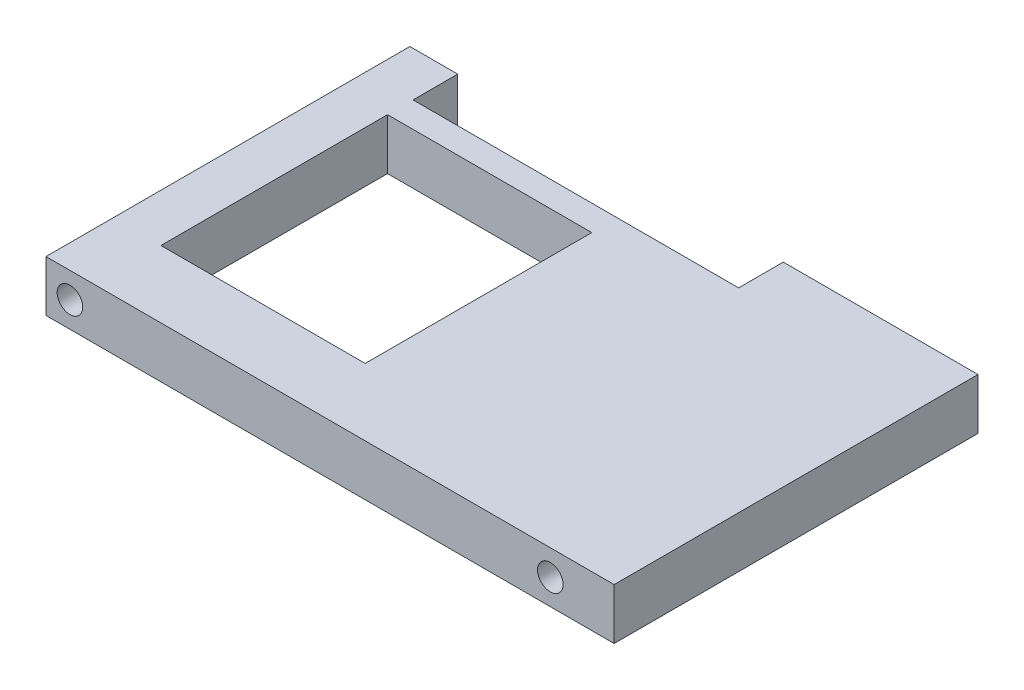
ISO-10303-21;
HEADER;
FILE_DESCRIPTION(('STEP AP214'),'2;1');
FILE_NAME('part.step','',(''),(''),'','','');
FILE_SCHEMA(('AUTOMOTIVE_DESIGN { 1 0 10303 214 1 1 1 1 }'));
ENDSEC;
DATA;
#1=APPLICATION_CONTEXT('core data for automotive mechanical design processes');
#2=APPLICATION_PROTOCOL_DEFINITION('international standard','automotive_design',2000,#1);
#3=PRODUCT_CONTEXT('',#1,'mechanical');
#4=PRODUCT('Part','Part','',(#3));
#5=PRODUCT_RELATED_PRODUCT_CATEGORY('part','',(#4));
#6=PRODUCT_DEFINITION_FORMATION('','',#4);
#7=PRODUCT_DEFINITION_CONTEXT('part definition',#1,'design');
#8=PRODUCT_DEFINITION('design','',#6,#7);
#9=PRODUCT_DEFINITION_SHAPE('','',#8);
#10=(LENGTH_UNIT() NAMED_UNIT(*) SI_UNIT(.MILLI.,.METRE.));
#11=(NAMED_UNIT(*) PLANE_ANGLE_UNIT() SI_UNIT($,.RADIAN.));
#12=(NAMED_UNIT(*) SI_UNIT($,.STERADIAN.) SOLID_ANGLE_UNIT());
#13=UNCERTAINTY_MEASURE_WITH_UNIT(LENGTH_MEASURE(1.E-05),#10,'distance_accuracy_value','');
#14=(GEOMETRIC_REPRESENTATION_CONTEXT(3) GLOBAL_UNCERTAINTY_ASSIGNED_CONTEXT((#13)) GLOBAL_UNIT_ASSIGNED_CONTEXT((#10,
#11,#12)) REPRESENTATION_CONTEXT('',''));
#15=CARTESIAN_POINT('',(0.,0.,0.));
#16=DIRECTION('',(0.,0.,1.));
#17=DIRECTION('',(1.,0.,0.));
#18=AXIS2_PLACEMENT_3D('',#15,#16,#17);
#19=CARTESIAN_POINT('',(0.,8.,-57.));
#20=DIRECTION('',(0.,0.,-1.));
#21=DIRECTION('',(-1.,0.,0.));
#22=AXIS2_PLACEMENT_3D('',#19,#20,#21);
#23=PLANE('',#22);
#24=CARTESIAN_POINT('',(3.75,4.,-57.));
#25=DIRECTION('',(0.,0.,1.));
#26=DIRECTION('',(1.,0.,0.));
#27=AXIS2_PLACEMENT_3D('',#24,#25,#26);
#28=CIRCLE('',#27,2.);
#29=CARTESIAN_POINT('',(5.75,4.,-57.));
#30=VERTEX_POINT('',#29);
#31=EDGE_CURVE('E272',#30,#30,#28,.T.);
#32=ORIENTED_EDGE('',*,*,#31,.T.);
#33=EDGE_LOOP('',(#32));
#34=FACE_BOUND('',#33,.T.);
#35=DIRECTION('',(1.,0.,0.));
#36=VECTOR('',#35,1.);
#37=CARTESIAN_POINT('',(0.,8.,-57.));
#38=LINE('',#37,#36);
#39=CARTESIAN_POINT('',(0.,8.,-57.));
#40=VERTEX_POINT('',#39);
#41=CARTESIAN_POINT('',(7.49999999999998,8.,-57.));
#42=VERTEX_POINT('',#41);
#43=EDGE_CURVE('E197',#40,#42,#38,.T.);
#44=ORIENTED_EDGE('',*,*,#43,.T.);
#45=DIRECTION('',(0.,1.,0.));
#46=VECTOR('',#45,1.);
#47=CARTESIAN_POINT('',(7.49999999999998,0.,-57.));
#48=LINE('',#47,#46);
#49=CARTESIAN_POINT('',(7.49999999999998,0.,-57.));
#50=VERTEX_POINT('',#49);
#51=EDGE_CURVE('E188',#50,#42,#48,.T.);
#52=ORIENTED_EDGE('',*,*,#51,.F.);
#53=DIRECTION('',(1.,0.,0.));
#54=VECTOR('',#53,1.);
#55=CARTESIAN_POINT('',(0.,0.,-57.));
#56=LINE('',#55,#54);
#57=CARTESIAN_POINT('',(0.,0.,-57.));
#58=VERTEX_POINT('',#57);
#59=EDGE_CURVE('E208',#58,#50,#56,.T.);
#60=ORIENTED_EDGE('',*,*,#59,.F.);
#61=DIRECTION('',(0.,-1.,0.));
#62=VECTOR('',#61,1.);
#63=CARTESIAN_POINT('',(0.,8.,-57.));
#64=LINE('',#63,#62);
#65=EDGE_CURVE('E41',#40,#58,#64,.T.);
#66=ORIENTED_EDGE('',*,*,#65,.F.);
#67=EDGE_LOOP('',(#44,#52,#60,#66));
#68=FACE_BOUND('',#67,.T.);
#69=ADVANCED_FACE('F37',(#34,#68),#23,.T.);
#70=CARTESIAN_POINT('',(0.,8.,0.));
#71=DIRECTION('',(0.,-1.,0.));
#72=DIRECTION('',(0.,0.,-1.));
#73=AXIS2_PLACEMENT_3D('',#70,#71,#72);
#74=PLANE('',#73);
#75=CARTESIAN_POINT('',(58.5,8.,-57.));
#76=VERTEX_POINT('',#75);
#77=CARTESIAN_POINT('',(89.,8.,-57.));
#78=VERTEX_POINT('',#77);
#79=EDGE_CURVE('E195',#76,#78,#38,.T.);
#80=ORIENTED_EDGE('',*,*,#79,.F.);
#81=DIRECTION('',(0.,0.,-1.));
#82=VECTOR('',#81,1.);
#83=CARTESIAN_POINT('',(58.5,8.,0.));
#84=LINE('',#83,#82);
#85=CARTESIAN_POINT('',(58.5,8.,-50.));
#86=VERTEX_POINT('',#85);
#87=EDGE_CURVE('E177',#86,#76,#84,.T.);
#88=ORIENTED_EDGE('',*,*,#87,.F.);
#89=DIRECTION('',(1.,0.,0.));
#90=VECTOR('',#89,1.);
#91=CARTESIAN_POINT('',(0.,8.,-50.));
#92=LINE('',#91,#90);
#93=CARTESIAN_POINT('',(7.49999999999997,8.,-50.));
#94=VERTEX_POINT('',#93);
#95=EDGE_CURVE('E171',#94,#86,#92,.T.);
#96=ORIENTED_EDGE('',*,*,#95,.F.);
#97=DIRECTION('',(0.,0.,-1.));
#98=VECTOR('',#97,1.);
#99=CARTESIAN_POINT('',(7.5,8.,0.));
#100=LINE('',#99,#98);
#101=EDGE_CURVE('E179',#94,#42,#100,.T.);
#102=ORIENTED_EDGE('',*,*,#101,.T.);
#103=ORIENTED_EDGE('',*,*,#43,.F.);
#104=DIRECTION('',(0.,0.,-1.));
#105=VECTOR('',#104,1.);
#106=CARTESIAN_POINT('',(0.,8.,0.));
#107=LINE('',#106,#105);
#108=CARTESIAN_POINT('',(0.,8.,0.));
#109=VERTEX_POINT('',#108);
#110=EDGE_CURVE('E192',#109,#40,#107,.T.);
#111=ORIENTED_EDGE('',*,*,#110,.F.);
#112=DIRECTION('',(1.,0.,0.));
#113=VECTOR('',#112,1.);
#114=CARTESIAN_POINT('',(0.,8.,0.));
#115=LINE('',#114,#113);
#116=CARTESIAN_POINT('',(89.,8.,0.));
#117=VERTEX_POINT('',#116);
#118=EDGE_CURVE('E203',#109,#117,#115,.T.);
#119=ORIENTED_EDGE('',*,*,#118,.T.);
#120=DIRECTION('',(0.,0.,-1.));
#121=VECTOR('',#120,1.);
#122=CARTESIAN_POINT('',(89.,8.,0.));
#123=LINE('',#122,#121);
#124=EDGE_CURVE('E200',#117,#78,#123,.T.);
#125=ORIENTED_EDGE('',*,*,#124,.T.);
#126=EDGE_LOOP('',(#80,#88,#96,#102,#103,#111,#119,#125));
#127=FACE_BOUND('',#126,.T.);
#128=DIRECTION('',(1.,0.,0.));
#129=VECTOR('',#128,1.);
#130=CARTESIAN_POINT('',(0.,8.,-46.));
#131=LINE('',#130,#129);
#132=CARTESIAN_POINT('',(7.49999999999998,8.,-46.));
#133=VERTEX_POINT('',#132);
#134=CARTESIAN_POINT('',(39.5,8.,-46.));
#135=VERTEX_POINT('',#134);
#136=EDGE_CURVE('E54',#133,#135,#131,.T.);
#137=ORIENTED_EDGE('',*,*,#136,.T.);
#138=DIRECTION('',(0.,0.,-1.));
#139=VECTOR('',#138,1.);
#140=CARTESIAN_POINT('',(39.5,8.,0.));
#141=LINE('',#140,#139);
#142=CARTESIAN_POINT('',(39.5,8.,-10.5));
#143=VERTEX_POINT('',#142);
#144=EDGE_CURVE('E144',#143,#135,#141,.T.);
#145=ORIENTED_EDGE('',*,*,#144,.F.);
#146=DIRECTION('',(1.,0.,0.));
#147=VECTOR('',#146,1.);
#148=CARTESIAN_POINT('',(0.,8.,-10.5));
#149=LINE('',#148,#147);
#150=CARTESIAN_POINT('',(7.49999999999999,8.,-10.5));
#151=VERTEX_POINT('',#150);
#152=EDGE_CURVE('E147',#151,#143,#149,.T.);
#153=ORIENTED_EDGE('',*,*,#152,.F.);
#154=DIRECTION('',(0.,0.,-1.));
#155=VECTOR('',#154,1.);
#156=CARTESIAN_POINT('',(7.5,8.,0.));
#157=LINE('',#156,#155);
#158=EDGE_CURVE('E156',#151,#133,#157,.T.);
#159=ORIENTED_EDGE('',*,*,#158,.T.);
#160=EDGE_LOOP('',(#137,#145,#153,#159));
#161=FACE_BOUND('',#160,.T.);
#162=ADVANCED_FACE('F241',(#127,#161),#74,.F.);
#163=CARTESIAN_POINT('',(0.,0.,0.));
#164=DIRECTION('',(0.,-1.,0.));
#165=DIRECTION('',(0.,0.,-1.));
#166=AXIS2_PLACEMENT_3D('',#163,#164,#165);
#167=PLANE('',#166);
#168=DIRECTION('',(0.,0.,-1.));
#169=VECTOR('',#168,1.);
#170=CARTESIAN_POINT('',(58.5,0.,0.));
#171=LINE('',#170,#169);
#172=CARTESIAN_POINT('',(58.5,0.,-50.));
#173=VERTEX_POINT('',#172);
#174=CARTESIAN_POINT('',(58.5,0.,-57.));
#175=VERTEX_POINT('',#174);
#176=EDGE_CURVE('E167',#173,#175,#171,.T.);
#177=ORIENTED_EDGE('',*,*,#176,.T.);
#178=CARTESIAN_POINT('',(89.,0.,-57.));
#179=VERTEX_POINT('',#178);
#180=EDGE_CURVE('E207',#175,#179,#56,.T.);
#181=ORIENTED_EDGE('',*,*,#180,.T.);
#182=DIRECTION('',(0.,0.,-1.));
#183=VECTOR('',#182,1.);
#184=CARTESIAN_POINT('',(89.,0.,0.));
#185=LINE('',#184,#183);
#186=CARTESIAN_POINT('',(89.,0.,0.));
#187=VERTEX_POINT('',#186);
#188=EDGE_CURVE('E211',#187,#179,#185,.T.);
#189=ORIENTED_EDGE('',*,*,#188,.F.);
#190=DIRECTION('',(1.,0.,0.));
#191=VECTOR('',#190,1.);
#192=CARTESIAN_POINT('',(0.,0.,0.));
#193=LINE('',#192,#191);
#194=CARTESIAN_POINT('',(0.,0.,0.));
#195=VERTEX_POINT('',#194);
#196=EDGE_CURVE('E196',#195,#187,#193,.T.);
#197=ORIENTED_EDGE('',*,*,#196,.F.);
#198=DIRECTION('',(0.,0.,-1.));
#199=VECTOR('',#198,1.);
#200=CARTESIAN_POINT('',(0.,0.,0.));
#201=LINE('',#200,#199);
#202=EDGE_CURVE('E163',#195,#58,#201,.T.);
#203=ORIENTED_EDGE('',*,*,#202,.T.);
#204=ORIENTED_EDGE('',*,*,#59,.T.);
#205=DIRECTION('',(0.,0.,-1.));
#206=VECTOR('',#205,1.);
#207=CARTESIAN_POINT('',(7.5,0.,0.));
#208=LINE('',#207,#206);
#209=CARTESIAN_POINT('',(7.49999999999997,0.,-50.));
#210=VERTEX_POINT('',#209);
#211=EDGE_CURVE('E170',#210,#50,#208,.T.);
#212=ORIENTED_EDGE('',*,*,#211,.F.);
#213=DIRECTION('',(1.,0.,0.));
#214=VECTOR('',#213,1.);
#215=CARTESIAN_POINT('',(0.,0.,-50.));
#216=LINE('',#215,#214);
#217=EDGE_CURVE('E173',#210,#173,#216,.T.);
#218=ORIENTED_EDGE('',*,*,#217,.T.);
#219=EDGE_LOOP('',(#177,#181,#189,#197,#203,#204,#212,#218));
#220=FACE_BOUND('',#219,.T.);
#221=DIRECTION('',(0.,0.,-1.));
#222=VECTOR('',#221,1.);
#223=CARTESIAN_POINT('',(39.5,0.,0.));
#224=LINE('',#223,#222);
#225=CARTESIAN_POINT('',(39.5,0.,-10.5));
#226=VERTEX_POINT('',#225);
#227=CARTESIAN_POINT('',(39.5,0.,-46.));
#228=VERTEX_POINT('',#227);
#229=EDGE_CURVE('E139',#226,#228,#224,.T.);
#230=ORIENTED_EDGE('',*,*,#229,.T.);
#231=DIRECTION('',(1.,0.,0.));
#232=VECTOR('',#231,1.);
#233=CARTESIAN_POINT('',(0.,0.,-46.));
#234=LINE('',#233,#232);
#235=CARTESIAN_POINT('',(7.49999999999998,0.,-46.));
#236=VERTEX_POINT('',#235);
#237=EDGE_CURVE('E135',#236,#228,#234,.T.);
#238=ORIENTED_EDGE('',*,*,#237,.F.);
#239=DIRECTION('',(0.,0.,-1.));
#240=VECTOR('',#239,1.);
#241=CARTESIAN_POINT('',(7.5,0.,0.));
#242=LINE('',#241,#240);
#243=CARTESIAN_POINT('',(7.49999999999999,0.,-10.5));
#244=VERTEX_POINT('',#243);
#245=EDGE_CURVE('E127',#244,#236,#242,.T.);
#246=ORIENTED_EDGE('',*,*,#245,.F.);
#247=DIRECTION('',(1.,0.,0.));
#248=VECTOR('',#247,1.);
#249=CARTESIAN_POINT('',(0.,0.,-10.5));
#250=LINE('',#249,#248);
#251=EDGE_CURVE('E62',#244,#226,#250,.T.);
#252=ORIENTED_EDGE('',*,*,#251,.T.);
#253=EDGE_LOOP('',(#230,#238,#246,#252));
#254=FACE_BOUND('',#253,.T.);
#255=ADVANCED_FACE('F142',(#220,#254),#167,.T.);
#256=CARTESIAN_POINT('',(0.,8.,0.));
#257=DIRECTION('',(-1.,0.,0.));
#258=DIRECTION('',(0.,0.,1.));
#259=AXIS2_PLACEMENT_3D('',#256,#257,#258);
#260=PLANE('',#259);
#261=ORIENTED_EDGE('',*,*,#202,.F.);
#262=DIRECTION('',(0.,-1.,0.));
#263=VECTOR('',#262,1.);
#264=CARTESIAN_POINT('',(0.,8.,0.));
#265=LINE('',#264,#263);
#266=EDGE_CURVE('E11',#109,#195,#265,.T.);
#267=ORIENTED_EDGE('',*,*,#266,.F.);
#268=ORIENTED_EDGE('',*,*,#110,.T.);
#269=ORIENTED_EDGE('',*,*,#65,.T.);
#270=EDGE_LOOP('',(#261,#267,#268,#269));
#271=FACE_BOUND('',#270,.T.);
#272=ADVANCED_FACE('F39',(#271),#260,.T.);
#273=CARTESIAN_POINT('',(0.,8.,0.));
#274=DIRECTION('',(0.,0.,-1.));
#275=DIRECTION('',(-1.,0.,0.));
#276=AXIS2_PLACEMENT_3D('',#273,#274,#275);
#277=PLANE('',#276);
#278=CARTESIAN_POINT('',(3.75,4.,0.));
#279=DIRECTION('',(0.,0.,1.));
#280=DIRECTION('',(1.,0.,0.));
#281=AXIS2_PLACEMENT_3D('',#278,#279,#280);
#282=CIRCLE('',#281,2.);
#283=CARTESIAN_POINT('',(5.75,4.,0.));
#284=VERTEX_POINT('',#283);
#285=EDGE_CURVE('E286',#284,#284,#282,.T.);
#286=ORIENTED_EDGE('',*,*,#285,.F.);
#287=EDGE_LOOP('',(#286));
#288=FACE_BOUND('',#287,.T.);
#289=CARTESIAN_POINT('',(79.,4.,0.));
#290=DIRECTION('',(0.,0.,1.));
#291=DIRECTION('',(1.,0.,0.));
#292=AXIS2_PLACEMENT_3D('',#289,#290,#291);
#293=CIRCLE('',#292,2.);
#294=CARTESIAN_POINT('',(81.,4.,0.));
#295=VERTEX_POINT('',#294);
#296=EDGE_CURVE('E288',#295,#295,#293,.T.);
#297=ORIENTED_EDGE('',*,*,#296,.F.);
#298=EDGE_LOOP('',(#297));
#299=FACE_BOUND('',#298,.T.);
#300=ORIENTED_EDGE('',*,*,#196,.T.);
#301=DIRECTION('',(0.,-1.,0.));
#302=VECTOR('',#301,1.);
#303=CARTESIAN_POINT('',(89.,8.,0.));
#304=LINE('',#303,#302);
#305=EDGE_CURVE('E46',#117,#187,#304,.T.);
#306=ORIENTED_EDGE('',*,*,#305,.F.);
#307=ORIENTED_EDGE('',*,*,#118,.F.);
#308=ORIENTED_EDGE('',*,*,#266,.T.);
#309=EDGE_LOOP('',(#300,#306,#307,#308));
#310=FACE_BOUND('',#309,.T.);
#311=ADVANCED_FACE('F234',(#288,#299,#310),#277,.F.);
#312=CARTESIAN_POINT('',(89.,8.,0.));
#313=DIRECTION('',(-1.,0.,0.));
#314=DIRECTION('',(0.,0.,1.));
#315=AXIS2_PLACEMENT_3D('',#312,#313,#314);
#316=PLANE('',#315);
#317=ORIENTED_EDGE('',*,*,#188,.T.);
#318=DIRECTION('',(0.,-1.,0.));
#319=VECTOR('',#318,1.);
#320=CARTESIAN_POINT('',(89.,8.,-57.));
#321=LINE('',#320,#319);
#322=EDGE_CURVE('E216',#78,#179,#321,.T.);
#323=ORIENTED_EDGE('',*,*,#322,.F.);
#324=ORIENTED_EDGE('',*,*,#124,.F.);
#325=ORIENTED_EDGE('',*,*,#305,.T.);
#326=EDGE_LOOP('',(#317,#323,#324,#325));
#327=FACE_BOUND('',#326,.T.);
#328=ADVANCED_FACE('F238',(#327),#316,.F.);
#329=CARTESIAN_POINT('',(79.,4.,-57.));
#330=DIRECTION('',(0.,0.,1.));
#331=DIRECTION('',(1.,0.,0.));
#332=AXIS2_PLACEMENT_3D('',#329,#330,#331);
#333=CIRCLE('',#332,2.);
#334=CARTESIAN_POINT('',(81.,4.,-57.));
#335=VERTEX_POINT('',#334);
#336=EDGE_CURVE('E280',#335,#335,#333,.T.);
#337=ORIENTED_EDGE('',*,*,#336,.T.);
#338=EDGE_LOOP('',(#337));
#339=FACE_BOUND('',#338,.T.);
#340=DIRECTION('',(0.,1.,0.));
#341=VECTOR('',#340,1.);
#342=CARTESIAN_POINT('',(58.5,0.,-57.));
#343=LINE('',#342,#341);
#344=EDGE_CURVE('E176',#175,#76,#343,.T.);
#345=ORIENTED_EDGE('',*,*,#344,.T.);
#346=ORIENTED_EDGE('',*,*,#79,.T.);
#347=ORIENTED_EDGE('',*,*,#322,.T.);
#348=ORIENTED_EDGE('',*,*,#180,.F.);
#349=EDGE_LOOP('',(#345,#346,#347,#348));
#350=FACE_BOUND('',#349,.T.);
#351=ADVANCED_FACE('F254',(#339,#350),#23,.T.);
#352=CARTESIAN_POINT('',(58.5,0.,0.));
#353=DIRECTION('',(1.,0.,0.));
#354=DIRECTION('',(0.,0.,-1.));
#355=AXIS2_PLACEMENT_3D('',#352,#353,#354);
#356=PLANE('',#355);
#357=ORIENTED_EDGE('',*,*,#87,.T.);
#358=ORIENTED_EDGE('',*,*,#344,.F.);
#359=ORIENTED_EDGE('',*,*,#176,.F.);
#360=DIRECTION('',(0.,1.,0.));
#361=VECTOR('',#360,1.);
#362=CARTESIAN_POINT('',(58.5,0.,-50.));
#363=LINE('',#362,#361);
#364=EDGE_CURVE('E157',#173,#86,#363,.T.);
#365=ORIENTED_EDGE('',*,*,#364,.T.);
#366=EDGE_LOOP('',(#357,#358,#359,#365));
#367=FACE_BOUND('',#366,.T.);
#368=ADVANCED_FACE('F253',(#367),#356,.F.);
#369=CARTESIAN_POINT('',(0.,0.,-50.));
#370=DIRECTION('',(0.,0.,1.));
#371=DIRECTION('',(1.,0.,0.));
#372=AXIS2_PLACEMENT_3D('',#369,#370,#371);
#373=PLANE('',#372);
#374=ORIENTED_EDGE('',*,*,#95,.T.);
#375=ORIENTED_EDGE('',*,*,#364,.F.);
#376=ORIENTED_EDGE('',*,*,#217,.F.);
#377=DIRECTION('',(0.,1.,0.));
#378=VECTOR('',#377,1.);
#379=CARTESIAN_POINT('',(7.49999999999997,0.,-50.));
#380=LINE('',#379,#378);
#381=EDGE_CURVE('E186',#210,#94,#380,.T.);
#382=ORIENTED_EDGE('',*,*,#381,.T.);
#383=EDGE_LOOP('',(#374,#375,#376,#382));
#384=FACE_BOUND('',#383,.T.);
#385=ADVANCED_FACE('F251',(#384),#373,.F.);
#386=CARTESIAN_POINT('',(7.5,0.,0.));
#387=DIRECTION('',(1.,0.,0.));
#388=DIRECTION('',(0.,0.,-1.));
#389=AXIS2_PLACEMENT_3D('',#386,#387,#388);
#390=PLANE('',#389);
#391=ORIENTED_EDGE('',*,*,#101,.F.);
#392=ORIENTED_EDGE('',*,*,#381,.F.);
#393=ORIENTED_EDGE('',*,*,#211,.T.);
#394=ORIENTED_EDGE('',*,*,#51,.T.);
#395=EDGE_LOOP('',(#391,#392,#393,#394));
#396=FACE_BOUND('',#395,.T.);
#397=ADVANCED_FACE('F248',(#396),#390,.T.);
#398=CARTESIAN_POINT('',(0.,0.,-46.));
#399=DIRECTION('',(0.,0.,1.));
#400=DIRECTION('',(1.,0.,0.));
#401=AXIS2_PLACEMENT_3D('',#398,#399,#400);
#402=PLANE('',#401);
#403=ORIENTED_EDGE('',*,*,#136,.F.);
#404=DIRECTION('',(0.,1.,0.));
#405=VECTOR('',#404,1.);
#406=CARTESIAN_POINT('',(7.49999999999998,0.,-46.));
#407=LINE('',#406,#405);
#408=EDGE_CURVE('E130',#236,#133,#407,.T.);
#409=ORIENTED_EDGE('',*,*,#408,.F.);
#410=ORIENTED_EDGE('',*,*,#237,.T.);
#411=DIRECTION('',(0.,1.,0.));
#412=VECTOR('',#411,1.);
#413=CARTESIAN_POINT('',(39.5,0.,-46.));
#414=LINE('',#413,#412);
#415=EDGE_CURVE('E161',#228,#135,#414,.T.);
#416=ORIENTED_EDGE('',*,*,#415,.T.);
#417=EDGE_LOOP('',(#403,#409,#410,#416));
#418=FACE_BOUND('',#417,.T.);
#419=ADVANCED_FACE('F137',(#418),#402,.T.);
#420=CARTESIAN_POINT('',(39.5,0.,0.));
#421=DIRECTION('',(1.,0.,0.));
#422=DIRECTION('',(0.,0.,-1.));
#423=AXIS2_PLACEMENT_3D('',#420,#421,#422);
#424=PLANE('',#423);
#425=ORIENTED_EDGE('',*,*,#144,.T.);
#426=ORIENTED_EDGE('',*,*,#415,.F.);
#427=ORIENTED_EDGE('',*,*,#229,.F.);
#428=DIRECTION('',(0.,1.,0.));
#429=VECTOR('',#428,1.);
#430=CARTESIAN_POINT('',(39.5,0.,-10.5));
#431=LINE('',#430,#429);
#432=EDGE_CURVE('E164',#226,#143,#431,.T.);
#433=ORIENTED_EDGE('',*,*,#432,.T.);
#434=EDGE_LOOP('',(#425,#426,#427,#433));
#435=FACE_BOUND('',#434,.T.);
#436=ADVANCED_FACE('F311',(#435),#424,.F.);
#437=CARTESIAN_POINT('',(0.,0.,-10.5));
#438=DIRECTION('',(0.,0.,1.));
#439=DIRECTION('',(1.,0.,0.));
#440=AXIS2_PLACEMENT_3D('',#437,#438,#439);
#441=PLANE('',#440);
#442=ORIENTED_EDGE('',*,*,#152,.T.);
#443=ORIENTED_EDGE('',*,*,#432,.F.);
#444=ORIENTED_EDGE('',*,*,#251,.F.);
#445=DIRECTION('',(0.,1.,0.));
#446=VECTOR('',#445,1.);
#447=CARTESIAN_POINT('',(7.49999999999999,0.,-10.5));
#448=LINE('',#447,#446);
#449=EDGE_CURVE('E132',#244,#151,#448,.T.);
#450=ORIENTED_EDGE('',*,*,#449,.T.);
#451=EDGE_LOOP('',(#442,#443,#444,#450));
#452=FACE_BOUND('',#451,.T.);
#453=ADVANCED_FACE('F306',(#452),#441,.F.);
#454=CARTESIAN_POINT('',(7.5,0.,0.));
#455=DIRECTION('',(1.,0.,0.));
#456=DIRECTION('',(0.,0.,-1.));
#457=AXIS2_PLACEMENT_3D('',#454,#455,#456);
#458=PLANE('',#457);
#459=ORIENTED_EDGE('',*,*,#158,.F.);
#460=ORIENTED_EDGE('',*,*,#449,.F.);
#461=ORIENTED_EDGE('',*,*,#245,.T.);
#462=ORIENTED_EDGE('',*,*,#408,.T.);
#463=EDGE_LOOP('',(#459,#460,#461,#462));
#464=FACE_BOUND('',#463,.T.);
#465=ADVANCED_FACE('F129',(#464),#458,.T.);
#466=CARTESIAN_POINT('',(79.,4.,-6.7));
#467=DIRECTION('',(0.,0.,1.));
#468=DIRECTION('',(1.,0.,0.));
#469=AXIS2_PLACEMENT_3D('',#466,#467,#468);
#470=CYLINDRICAL_SURFACE('',#469,2.);
#471=CARTESIAN_POINT('',(79.,4.,-6.7));
#472=DIRECTION('',(0.,0.,1.));
#473=DIRECTION('',(1.,0.,0.));
#474=AXIS2_PLACEMENT_3D('',#471,#472,#473);
#475=CIRCLE('',#474,2.);
#476=CARTESIAN_POINT('',(81.,4.,-6.7));
#477=VERTEX_POINT('',#476);
#478=EDGE_CURVE('E150',#477,#477,#475,.T.);
#479=ORIENTED_EDGE('',*,*,#478,.F.);
#480=EDGE_LOOP('',(#479));
#481=FACE_BOUND('',#480,.T.);
#482=ORIENTED_EDGE('',*,*,#296,.T.);
#483=EDGE_LOOP('',(#482));
#484=FACE_BOUND('',#483,.T.);
#485=ADVANCED_FACE('F297',(#481,#484),#470,.F.);
#486=CARTESIAN_POINT('',(79.,4.,-6.7));
#487=DIRECTION('',(0.,0.,1.));
#488=DIRECTION('',(1.,0.,0.));
#489=AXIS2_PLACEMENT_3D('',#486,#487,#488);
#490=PLANE('',#489);
#491=ORIENTED_EDGE('',*,*,#478,.T.);
#492=EDGE_LOOP('',(#491));
#493=FACE_BOUND('',#492,.T.);
#494=ADVANCED_FACE('F295',(#493),#490,.T.);
#495=CARTESIAN_POINT('',(3.75,4.,-6.7));
#496=DIRECTION('',(0.,0.,1.));
#497=DIRECTION('',(1.,0.,0.));
#498=AXIS2_PLACEMENT_3D('',#495,#496,#497);
#499=CYLINDRICAL_SURFACE('',#498,2.);
#500=CARTESIAN_POINT('',(3.75,4.,-6.7));
#501=DIRECTION('',(0.,0.,1.));
#502=DIRECTION('',(1.,0.,0.));
#503=AXIS2_PLACEMENT_3D('',#500,#501,#502);
#504=CIRCLE('',#503,2.);
#505=CARTESIAN_POINT('',(5.75,4.,-6.7));
#506=VERTEX_POINT('',#505);
#507=EDGE_CURVE('E180',#506,#506,#504,.T.);
#508=ORIENTED_EDGE('',*,*,#507,.F.);
#509=EDGE_LOOP('',(#508));
#510=FACE_BOUND('',#509,.T.);
#511=ORIENTED_EDGE('',*,*,#285,.T.);
#512=EDGE_LOOP('',(#511));
#513=FACE_BOUND('',#512,.T.);
#514=ADVANCED_FACE('F304',(#510,#513),#499,.F.);
#515=CARTESIAN_POINT('',(3.75,4.,-6.7));
#516=DIRECTION('',(0.,0.,1.));
#517=DIRECTION('',(1.,0.,0.));
#518=AXIS2_PLACEMENT_3D('',#515,#516,#517);
#519=PLANE('',#518);
#520=ORIENTED_EDGE('',*,*,#507,.T.);
#521=EDGE_LOOP('',(#520));
#522=FACE_BOUND('',#521,.T.);
#523=ADVANCED_FACE('F334',(#522),#519,.T.);
#524=CARTESIAN_POINT('',(79.,4.,-50.3));
#525=DIRECTION('',(0.,0.,-1.));
#526=DIRECTION('',(-1.,0.,0.));
#527=AXIS2_PLACEMENT_3D('',#524,#525,#526);
#528=CYLINDRICAL_SURFACE('',#527,2.);
#529=CARTESIAN_POINT('',(79.,4.,-50.3));
#530=DIRECTION('',(0.,0.,1.));
#531=DIRECTION('',(1.,0.,0.));
#532=AXIS2_PLACEMENT_3D('',#529,#530,#531);
#533=CIRCLE('',#532,2.);
#534=CARTESIAN_POINT('',(81.,4.,-50.3));
#535=VERTEX_POINT('',#534);
#536=EDGE_CURVE('E275',#535,#535,#533,.T.);
#537=ORIENTED_EDGE('',*,*,#536,.T.);
#538=EDGE_LOOP('',(#537));
#539=FACE_BOUND('',#538,.T.);
#540=ORIENTED_EDGE('',*,*,#336,.F.);
#541=EDGE_LOOP('',(#540));
#542=FACE_BOUND('',#541,.T.);
#543=ADVANCED_FACE('F339',(#539,#542),#528,.F.);
#544=CARTESIAN_POINT('',(79.,4.,-50.3));
#545=DIRECTION('',(0.,0.,-1.));
#546=DIRECTION('',(1.,0.,0.));
#547=AXIS2_PLACEMENT_3D('',#544,#545,#546);
#548=PLANE('',#547);
#549=ORIENTED_EDGE('',*,*,#536,.F.);
#550=EDGE_LOOP('',(#549));
#551=FACE_BOUND('',#550,.T.);
#552=ADVANCED_FACE('F345',(#551),#548,.T.);
#553=CARTESIAN_POINT('',(3.75,4.,-50.3));
#554=DIRECTION('',(0.,0.,-1.));
#555=DIRECTION('',(-1.,0.,0.));
#556=AXIS2_PLACEMENT_3D('',#553,#554,#555);
#557=CYLINDRICAL_SURFACE('',#556,2.);
#558=CARTESIAN_POINT('',(3.75,4.,-50.3));
#559=DIRECTION('',(0.,0.,1.));
#560=DIRECTION('',(1.,0.,0.));
#561=AXIS2_PLACEMENT_3D('',#558,#559,#560);
#562=CIRCLE('',#561,2.);
#563=CARTESIAN_POINT('',(5.75,4.,-50.3));
#564=VERTEX_POINT('',#563);
#565=EDGE_CURVE('E274',#564,#564,#562,.T.);
#566=ORIENTED_EDGE('',*,*,#565,.T.);
#567=EDGE_LOOP('',(#566));
#568=FACE_BOUND('',#567,.T.);
#569=ORIENTED_EDGE('',*,*,#31,.F.);
#570=EDGE_LOOP('',(#569));
#571=FACE_BOUND('',#570,.T.);
#572=ADVANCED_FACE('F351',(#568,#571),#557,.F.);
#573=CARTESIAN_POINT('',(3.75,4.,-50.3));
#574=DIRECTION('',(0.,0.,-1.));
#575=DIRECTION('',(1.,0.,0.));
#576=AXIS2_PLACEMENT_3D('',#573,#574,#575);
#577=PLANE('',#576);
#578=ORIENTED_EDGE('',*,*,#565,.F.);
#579=EDGE_LOOP('',(#578));
#580=FACE_BOUND('',#579,.T.);
#581=ADVANCED_FACE('F355',(#580),#577,.T.);
#582=CLOSED_SHELL('',(#69,#162,#255,#272,#311,#328,#351,#368,#385,#397,#419,#436,#453,#465,#485,
#494,#514,#523,#543,#552,#572,#581));
#583=MANIFOLD_SOLID_BREP('B2',#582);
#584=ADVANCED_BREP_SHAPE_REPRESENTATION('',(#18,#583),#14);
#585=SHAPE_DEFINITION_REPRESENTATION(#9,#584);
ENDSEC;
END-ISO-10303-21;
